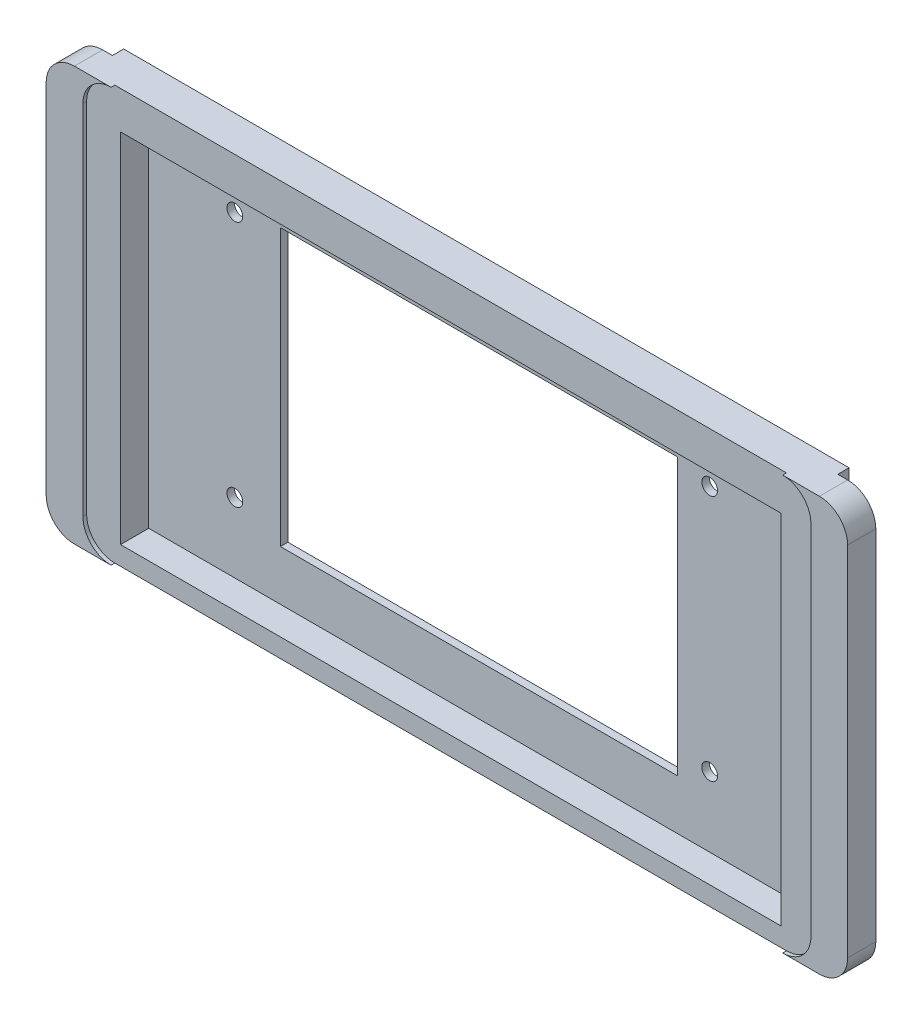
ISO-10303-21;
HEADER;
FILE_DESCRIPTION(('STEP AP214'),'2;1');
FILE_NAME('part.step','',(''),(''),'','','');
FILE_SCHEMA(('AUTOMOTIVE_DESIGN { 1 0 10303 214 1 1 1 1 }'));
ENDSEC;
DATA;
#1=APPLICATION_CONTEXT('core data for automotive mechanical design processes');
#2=APPLICATION_PROTOCOL_DEFINITION('international standard','automotive_design',2000,#1);
#3=PRODUCT_CONTEXT('',#1,'mechanical');
#4=PRODUCT('Part','Part','',(#3));
#5=PRODUCT_RELATED_PRODUCT_CATEGORY('part','',(#4));
#6=PRODUCT_DEFINITION_FORMATION('','',#4);
#7=PRODUCT_DEFINITION_CONTEXT('part definition',#1,'design');
#8=PRODUCT_DEFINITION('design','',#6,#7);
#9=PRODUCT_DEFINITION_SHAPE('','',#8);
#10=(LENGTH_UNIT() NAMED_UNIT(*) SI_UNIT(.MILLI.,.METRE.));
#11=(NAMED_UNIT(*) PLANE_ANGLE_UNIT() SI_UNIT($,.RADIAN.));
#12=(NAMED_UNIT(*) SI_UNIT($,.STERADIAN.) SOLID_ANGLE_UNIT());
#13=UNCERTAINTY_MEASURE_WITH_UNIT(LENGTH_MEASURE(1.E-05),#10,'distance_accuracy_value','');
#14=(GEOMETRIC_REPRESENTATION_CONTEXT(3) GLOBAL_UNCERTAINTY_ASSIGNED_CONTEXT((#13)) GLOBAL_UNIT_ASSIGNED_CONTEXT((#10,
#11,#12)) REPRESENTATION_CONTEXT('',''));
#15=CARTESIAN_POINT('',(0.,0.,0.));
#16=DIRECTION('',(0.,0.,1.));
#17=DIRECTION('',(1.,0.,0.));
#18=AXIS2_PLACEMENT_3D('',#15,#16,#17);
#19=CARTESIAN_POINT('',(99.,47.5,-10.5));
#20=DIRECTION('',(0.,0.,1.));
#21=DIRECTION('',(1.,0.,0.));
#22=AXIS2_PLACEMENT_3D('',#19,#20,#21);
#23=CYLINDRICAL_SURFACE('',#22,7.5);
#24=DIRECTION('',(0.,0.,1.));
#25=VECTOR('',#24,1.);
#26=CARTESIAN_POINT('',(106.5,47.4999999999999,-10.5));
#27=LINE('',#26,#25);
#28=CARTESIAN_POINT('',(106.5,47.4999999999999,-7.5));
#29=VERTEX_POINT('',#28);
#30=CARTESIAN_POINT('',(106.5,47.4999999999999,0.));
#31=VERTEX_POINT('',#30);
#32=EDGE_CURVE('E270',#29,#31,#27,.T.);
#33=ORIENTED_EDGE('',*,*,#32,.F.);
#34=CARTESIAN_POINT('',(99.,47.5,-7.5));
#35=DIRECTION('',(0.,0.,-1.));
#36=DIRECTION('',(1.,0.,0.));
#37=AXIS2_PLACEMENT_3D('',#34,#35,#36);
#38=CIRCLE('',#37,7.5);
#39=CARTESIAN_POINT('',(99.,55.,-7.5));
#40=VERTEX_POINT('',#39);
#41=EDGE_CURVE('E552',#40,#29,#38,.T.);
#42=ORIENTED_EDGE('',*,*,#41,.F.);
#43=DIRECTION('',(0.,0.,1.));
#44=VECTOR('',#43,1.);
#45=CARTESIAN_POINT('',(99.,55.,-10.5));
#46=LINE('',#45,#44);
#47=CARTESIAN_POINT('',(99.,55.,0.));
#48=VERTEX_POINT('',#47);
#49=EDGE_CURVE('E331',#40,#48,#46,.T.);
#50=ORIENTED_EDGE('',*,*,#49,.T.);
#51=CARTESIAN_POINT('',(99.,47.5,0.));
#52=DIRECTION('',(0.,0.,1.));
#53=DIRECTION('',(-1.,0.,0.));
#54=AXIS2_PLACEMENT_3D('',#51,#52,#53);
#55=CIRCLE('',#54,7.5);
#56=EDGE_CURVE('E321',#31,#48,#55,.T.);
#57=ORIENTED_EDGE('',*,*,#56,.F.);
#58=EDGE_LOOP('',(#33,#42,#50,#57));
#59=FACE_BOUND('',#58,.T.);
#60=ADVANCED_FACE('F53',(#59),#23,.T.);
#61=CARTESIAN_POINT('',(106.5,47.4999999999999,-10.5));
#62=DIRECTION('',(1.,0.,0.));
#63=DIRECTION('',(0.,0.,-1.));
#64=AXIS2_PLACEMENT_3D('',#61,#62,#63);
#65=PLANE('',#64);
#66=DIRECTION('',(0.,0.,1.));
#67=VECTOR('',#66,1.);
#68=CARTESIAN_POINT('',(106.5,-47.4999999999999,-10.5));
#69=LINE('',#68,#67);
#70=CARTESIAN_POINT('',(106.5,-47.4999999999999,-7.5));
#71=VERTEX_POINT('',#70);
#72=CARTESIAN_POINT('',(106.5,-47.4999999999999,0.));
#73=VERTEX_POINT('',#72);
#74=EDGE_CURVE('E265',#71,#73,#69,.T.);
#75=ORIENTED_EDGE('',*,*,#74,.F.);
#76=DIRECTION('',(0.,-1.,0.));
#77=VECTOR('',#76,1.);
#78=CARTESIAN_POINT('',(106.5,47.4999999999999,-7.5));
#79=LINE('',#78,#77);
#80=EDGE_CURVE('E244',#29,#71,#79,.T.);
#81=ORIENTED_EDGE('',*,*,#80,.F.);
#82=ORIENTED_EDGE('',*,*,#32,.T.);
#83=DIRECTION('',(0.,1.,0.));
#84=VECTOR('',#83,1.);
#85=CARTESIAN_POINT('',(106.5,47.4999999999999,0.));
#86=LINE('',#85,#84);
#87=EDGE_CURVE('E317',#73,#31,#86,.T.);
#88=ORIENTED_EDGE('',*,*,#87,.F.);
#89=EDGE_LOOP('',(#75,#81,#82,#88));
#90=FACE_BOUND('',#89,.T.);
#91=ADVANCED_FACE('F338',(#90),#65,.T.);
#92=CARTESIAN_POINT('',(99.,-47.5,-10.5));
#93=DIRECTION('',(0.,0.,1.));
#94=DIRECTION('',(1.,0.,0.));
#95=AXIS2_PLACEMENT_3D('',#92,#93,#94);
#96=CYLINDRICAL_SURFACE('',#95,7.5);
#97=DIRECTION('',(0.,0.,1.));
#98=VECTOR('',#97,1.);
#99=CARTESIAN_POINT('',(99.,-55.,-10.5));
#100=LINE('',#99,#98);
#101=CARTESIAN_POINT('',(98.9999999999999,-55.,-7.5));
#102=VERTEX_POINT('',#101);
#103=CARTESIAN_POINT('',(99.,-55.,0.));
#104=VERTEX_POINT('',#103);
#105=EDGE_CURVE('E254',#102,#104,#100,.T.);
#106=ORIENTED_EDGE('',*,*,#105,.F.);
#107=CARTESIAN_POINT('',(99.,-47.5,-7.5));
#108=DIRECTION('',(0.,0.,-1.));
#109=DIRECTION('',(-1.,0.,0.));
#110=AXIS2_PLACEMENT_3D('',#107,#108,#109);
#111=CIRCLE('',#110,7.5);
#112=EDGE_CURVE('E238',#71,#102,#111,.T.);
#113=ORIENTED_EDGE('',*,*,#112,.F.);
#114=ORIENTED_EDGE('',*,*,#74,.T.);
#115=CARTESIAN_POINT('',(99.,-47.5,0.));
#116=DIRECTION('',(0.,0.,1.));
#117=DIRECTION('',(1.,0.,0.));
#118=AXIS2_PLACEMENT_3D('',#115,#116,#117);
#119=CIRCLE('',#118,7.5);
#120=EDGE_CURVE('E263',#104,#73,#119,.T.);
#121=ORIENTED_EDGE('',*,*,#120,.F.);
#122=EDGE_LOOP('',(#106,#113,#114,#121));
#123=FACE_BOUND('',#122,.T.);
#124=ADVANCED_FACE('F261',(#123),#96,.T.);
#125=CARTESIAN_POINT('',(-64.86,-31.45,-1.));
#126=DIRECTION('',(0.,0.,1.));
#127=DIRECTION('',(1.,0.,0.));
#128=AXIS2_PLACEMENT_3D('',#125,#126,#127);
#129=CYLINDRICAL_SURFACE('',#128,2.1);
#130=CARTESIAN_POINT('',(-64.86,-31.45,-10.5));
#131=DIRECTION('',(0.,0.,1.));
#132=DIRECTION('',(1.,0.,0.));
#133=AXIS2_PLACEMENT_3D('',#130,#131,#132);
#134=CIRCLE('',#133,2.1);
#135=CARTESIAN_POINT('',(-62.76,-31.45,-10.5));
#136=VERTEX_POINT('',#135);
#137=EDGE_CURVE('E428',#136,#136,#134,.T.);
#138=ORIENTED_EDGE('',*,*,#137,.F.);
#139=EDGE_LOOP('',(#138));
#140=FACE_BOUND('',#139,.T.);
#141=CARTESIAN_POINT('',(-64.86,-31.45,-8.5));
#142=DIRECTION('',(0.,0.,1.));
#143=DIRECTION('',(1.,0.,0.));
#144=AXIS2_PLACEMENT_3D('',#141,#142,#143);
#145=CIRCLE('',#144,2.1);
#146=CARTESIAN_POINT('',(-62.76,-31.45,-8.5));
#147=VERTEX_POINT('',#146);
#148=EDGE_CURVE('E476',#147,#147,#145,.F.);
#149=ORIENTED_EDGE('',*,*,#148,.F.);
#150=EDGE_LOOP('',(#149));
#151=FACE_BOUND('',#150,.T.);
#152=ADVANCED_FACE('F661',(#140,#151),#129,.F.);
#153=CARTESIAN_POINT('',(61.34,-31.45,-1.));
#154=DIRECTION('',(0.,0.,1.));
#155=DIRECTION('',(1.,0.,0.));
#156=AXIS2_PLACEMENT_3D('',#153,#154,#155);
#157=CYLINDRICAL_SURFACE('',#156,2.1);
#158=CARTESIAN_POINT('',(61.34,-31.45,-10.5));
#159=DIRECTION('',(0.,0.,1.));
#160=DIRECTION('',(1.,0.,0.));
#161=AXIS2_PLACEMENT_3D('',#158,#159,#160);
#162=CIRCLE('',#161,2.1);
#163=CARTESIAN_POINT('',(63.44,-31.45,-10.5));
#164=VERTEX_POINT('',#163);
#165=EDGE_CURVE('E432',#164,#164,#162,.T.);
#166=ORIENTED_EDGE('',*,*,#165,.F.);
#167=EDGE_LOOP('',(#166));
#168=FACE_BOUND('',#167,.T.);
#169=CARTESIAN_POINT('',(61.34,-31.45,-8.5));
#170=DIRECTION('',(0.,0.,1.));
#171=DIRECTION('',(1.,0.,0.));
#172=AXIS2_PLACEMENT_3D('',#169,#170,#171);
#173=CIRCLE('',#172,2.1);
#174=CARTESIAN_POINT('',(63.44,-31.45,-8.5));
#175=VERTEX_POINT('',#174);
#176=EDGE_CURVE('E480',#175,#175,#173,.F.);
#177=ORIENTED_EDGE('',*,*,#176,.F.);
#178=EDGE_LOOP('',(#177));
#179=FACE_BOUND('',#178,.T.);
#180=ADVANCED_FACE('F698',(#168,#179),#157,.F.);
#181=CARTESIAN_POINT('',(61.34,34.2,-1.));
#182=DIRECTION('',(0.,0.,1.));
#183=DIRECTION('',(1.,0.,0.));
#184=AXIS2_PLACEMENT_3D('',#181,#182,#183);
#185=CYLINDRICAL_SURFACE('',#184,2.1);
#186=CARTESIAN_POINT('',(61.34,34.2,-10.5));
#187=DIRECTION('',(0.,0.,1.));
#188=DIRECTION('',(1.,0.,0.));
#189=AXIS2_PLACEMENT_3D('',#186,#187,#188);
#190=CIRCLE('',#189,2.1);
#191=CARTESIAN_POINT('',(63.44,34.2,-10.5));
#192=VERTEX_POINT('',#191);
#193=EDGE_CURVE('E436',#192,#192,#190,.T.);
#194=ORIENTED_EDGE('',*,*,#193,.F.);
#195=EDGE_LOOP('',(#194));
#196=FACE_BOUND('',#195,.T.);
#197=CARTESIAN_POINT('',(61.34,34.2,-8.5));
#198=DIRECTION('',(0.,0.,1.));
#199=DIRECTION('',(1.,0.,0.));
#200=AXIS2_PLACEMENT_3D('',#197,#198,#199);
#201=CIRCLE('',#200,2.1);
#202=CARTESIAN_POINT('',(63.44,34.2,-8.5));
#203=VERTEX_POINT('',#202);
#204=EDGE_CURVE('E484',#203,#203,#201,.F.);
#205=ORIENTED_EDGE('',*,*,#204,.F.);
#206=EDGE_LOOP('',(#205));
#207=FACE_BOUND('',#206,.T.);
#208=ADVANCED_FACE('F702',(#196,#207),#185,.F.);
#209=CARTESIAN_POINT('',(-64.86,34.2,-1.));
#210=DIRECTION('',(0.,0.,1.));
#211=DIRECTION('',(1.,0.,0.));
#212=AXIS2_PLACEMENT_3D('',#209,#210,#211);
#213=CYLINDRICAL_SURFACE('',#212,2.1);
#214=CARTESIAN_POINT('',(-64.86,34.2,-10.5));
#215=DIRECTION('',(0.,0.,1.));
#216=DIRECTION('',(1.,0.,0.));
#217=AXIS2_PLACEMENT_3D('',#214,#215,#216);
#218=CIRCLE('',#217,2.1);
#219=CARTESIAN_POINT('',(-62.76,34.2,-10.5));
#220=VERTEX_POINT('',#219);
#221=EDGE_CURVE('E440',#220,#220,#218,.T.);
#222=ORIENTED_EDGE('',*,*,#221,.F.);
#223=EDGE_LOOP('',(#222));
#224=FACE_BOUND('',#223,.T.);
#225=CARTESIAN_POINT('',(-64.86,34.2,-8.5));
#226=DIRECTION('',(0.,0.,1.));
#227=DIRECTION('',(1.,0.,0.));
#228=AXIS2_PLACEMENT_3D('',#225,#226,#227);
#229=CIRCLE('',#228,2.1);
#230=CARTESIAN_POINT('',(-62.76,34.2,-8.5));
#231=VERTEX_POINT('',#230);
#232=EDGE_CURVE('E488',#231,#231,#229,.F.);
#233=ORIENTED_EDGE('',*,*,#232,.F.);
#234=EDGE_LOOP('',(#233));
#235=FACE_BOUND('',#234,.T.);
#236=ADVANCED_FACE('F706',(#224,#235),#213,.F.);
#237=CARTESIAN_POINT('',(52.76,-36.6995399693422,-10.5));
#238=DIRECTION('',(1.,0.,0.));
#239=DIRECTION('',(0.,0.,-1.));
#240=AXIS2_PLACEMENT_3D('',#237,#238,#239);
#241=PLANE('',#240);
#242=DIRECTION('',(0.,-1.,0.));
#243=VECTOR('',#242,1.);
#244=CARTESIAN_POINT('',(52.76,-36.6995399693422,-8.5));
#245=LINE('',#244,#243);
#246=CARTESIAN_POINT('',(52.76,36.6995399693422,-8.5));
#247=VERTEX_POINT('',#246);
#248=CARTESIAN_POINT('',(52.76,-36.6995399693422,-8.5));
#249=VERTEX_POINT('',#248);
#250=EDGE_CURVE('E492',#247,#249,#245,.T.);
#251=ORIENTED_EDGE('',*,*,#250,.F.);
#252=DIRECTION('',(0.,0.,1.));
#253=VECTOR('',#252,1.);
#254=CARTESIAN_POINT('',(52.76,36.6995399693422,-10.5));
#255=LINE('',#254,#253);
#256=CARTESIAN_POINT('',(52.76,36.6995399693422,-10.5));
#257=VERTEX_POINT('',#256);
#258=EDGE_CURVE('E456',#257,#247,#255,.T.);
#259=ORIENTED_EDGE('',*,*,#258,.F.);
#260=DIRECTION('',(0.,1.,0.));
#261=VECTOR('',#260,1.);
#262=CARTESIAN_POINT('',(52.76,-36.6995399693422,-10.5));
#263=LINE('',#262,#261);
#264=CARTESIAN_POINT('',(52.76,-36.6995399693422,-10.5));
#265=VERTEX_POINT('',#264);
#266=EDGE_CURVE('E472',#265,#257,#263,.T.);
#267=ORIENTED_EDGE('',*,*,#266,.F.);
#268=DIRECTION('',(0.,0.,1.));
#269=VECTOR('',#268,1.);
#270=CARTESIAN_POINT('',(52.76,-36.6995399693422,-10.5));
#271=LINE('',#270,#269);
#272=EDGE_CURVE('E444',#265,#249,#271,.T.);
#273=ORIENTED_EDGE('',*,*,#272,.T.);
#274=EDGE_LOOP('',(#251,#259,#267,#273));
#275=FACE_BOUND('',#274,.T.);
#276=ADVANCED_FACE('F710',(#275),#241,.F.);
#277=CARTESIAN_POINT('',(-52.76,-36.6995399693422,-10.5));
#278=DIRECTION('',(0.,-1.,0.));
#279=DIRECTION('',(0.,0.,-1.));
#280=AXIS2_PLACEMENT_3D('',#277,#278,#279);
#281=PLANE('',#280);
#282=DIRECTION('',(-1.,0.,0.));
#283=VECTOR('',#282,1.);
#284=CARTESIAN_POINT('',(-52.76,-36.6995399693422,-8.5));
#285=LINE('',#284,#283);
#286=CARTESIAN_POINT('',(-52.76,-36.6995399693422,-8.5));
#287=VERTEX_POINT('',#286);
#288=EDGE_CURVE('E495',#249,#287,#285,.T.);
#289=ORIENTED_EDGE('',*,*,#288,.F.);
#290=ORIENTED_EDGE('',*,*,#272,.F.);
#291=DIRECTION('',(1.,0.,0.));
#292=VECTOR('',#291,1.);
#293=CARTESIAN_POINT('',(-52.76,-36.6995399693422,-10.5));
#294=LINE('',#293,#292);
#295=CARTESIAN_POINT('',(-52.76,-36.6995399693422,-10.5));
#296=VERTEX_POINT('',#295);
#297=EDGE_CURVE('E460',#296,#265,#294,.T.);
#298=ORIENTED_EDGE('',*,*,#297,.F.);
#299=DIRECTION('',(0.,0.,1.));
#300=VECTOR('',#299,1.);
#301=CARTESIAN_POINT('',(-52.76,-36.6995399693422,-10.5));
#302=LINE('',#301,#300);
#303=EDGE_CURVE('E448',#296,#287,#302,.T.);
#304=ORIENTED_EDGE('',*,*,#303,.T.);
#305=EDGE_LOOP('',(#289,#290,#298,#304));
#306=FACE_BOUND('',#305,.T.);
#307=ADVANCED_FACE('F714',(#306),#281,.F.);
#308=CARTESIAN_POINT('',(-52.76,-36.6995399693422,-10.5));
#309=DIRECTION('',(-1.,0.,0.));
#310=DIRECTION('',(0.,0.,1.));
#311=AXIS2_PLACEMENT_3D('',#308,#309,#310);
#312=PLANE('',#311);
#313=DIRECTION('',(0.,1.,0.));
#314=VECTOR('',#313,1.);
#315=CARTESIAN_POINT('',(-52.76,-36.6995399693422,-8.5));
#316=LINE('',#315,#314);
#317=CARTESIAN_POINT('',(-52.76,36.6995399693422,-8.5));
#318=VERTEX_POINT('',#317);
#319=EDGE_CURVE('E498',#287,#318,#316,.T.);
#320=ORIENTED_EDGE('',*,*,#319,.F.);
#321=ORIENTED_EDGE('',*,*,#303,.F.);
#322=DIRECTION('',(0.,-1.,0.));
#323=VECTOR('',#322,1.);
#324=CARTESIAN_POINT('',(-52.76,-36.6995399693422,-10.5));
#325=LINE('',#324,#323);
#326=CARTESIAN_POINT('',(-52.76,36.6995399693422,-10.5));
#327=VERTEX_POINT('',#326);
#328=EDGE_CURVE('E464',#327,#296,#325,.T.);
#329=ORIENTED_EDGE('',*,*,#328,.F.);
#330=DIRECTION('',(0.,0.,1.));
#331=VECTOR('',#330,1.);
#332=CARTESIAN_POINT('',(-52.76,36.6995399693422,-10.5));
#333=LINE('',#332,#331);
#334=EDGE_CURVE('E452',#327,#318,#333,.T.);
#335=ORIENTED_EDGE('',*,*,#334,.T.);
#336=EDGE_LOOP('',(#320,#321,#329,#335));
#337=FACE_BOUND('',#336,.T.);
#338=ADVANCED_FACE('F718',(#337),#312,.F.);
#339=CARTESIAN_POINT('',(-52.76,36.6995399693422,-10.5));
#340=DIRECTION('',(0.,1.,0.));
#341=DIRECTION('',(0.,0.,1.));
#342=AXIS2_PLACEMENT_3D('',#339,#340,#341);
#343=PLANE('',#342);
#344=DIRECTION('',(1.,0.,0.));
#345=VECTOR('',#344,1.);
#346=CARTESIAN_POINT('',(-52.76,36.6995399693422,-8.5));
#347=LINE('',#346,#345);
#348=EDGE_CURVE('E12',#318,#247,#347,.T.);
#349=ORIENTED_EDGE('',*,*,#348,.F.);
#350=ORIENTED_EDGE('',*,*,#334,.F.);
#351=DIRECTION('',(-1.,0.,0.));
#352=VECTOR('',#351,1.);
#353=CARTESIAN_POINT('',(-52.76,36.6995399693422,-10.5));
#354=LINE('',#353,#352);
#355=EDGE_CURVE('E468',#257,#327,#354,.T.);
#356=ORIENTED_EDGE('',*,*,#355,.F.);
#357=ORIENTED_EDGE('',*,*,#258,.T.);
#358=EDGE_LOOP('',(#349,#350,#356,#357));
#359=FACE_BOUND('',#358,.T.);
#360=ADVANCED_FACE('F664',(#359),#343,.F.);
#361=CARTESIAN_POINT('',(-98.9999999999999,-55.,-10.5));
#362=DIRECTION('',(0.,-1.,0.));
#363=DIRECTION('',(0.,0.,-1.));
#364=AXIS2_PLACEMENT_3D('',#361,#362,#363);
#365=PLANE('',#364);
#366=DIRECTION('',(0.,0.,-1.));
#367=VECTOR('',#366,1.);
#368=CARTESIAN_POINT('',(96.4,-55.,-7.5));
#369=LINE('',#368,#367);
#370=CARTESIAN_POINT('',(96.4,-55.,-7.5));
#371=VERTEX_POINT('',#370);
#372=CARTESIAN_POINT('',(96.4,-55.,-10.5));
#373=VERTEX_POINT('',#372);
#374=EDGE_CURVE('E69',#371,#373,#369,.T.);
#375=ORIENTED_EDGE('',*,*,#374,.F.);
#376=DIRECTION('',(-1.,0.,0.));
#377=VECTOR('',#376,1.);
#378=CARTESIAN_POINT('',(96.4,-55.,-7.5));
#379=LINE('',#378,#377);
#380=EDGE_CURVE('E242',#102,#371,#379,.T.);
#381=ORIENTED_EDGE('',*,*,#380,.F.);
#382=ORIENTED_EDGE('',*,*,#105,.T.);
#383=DIRECTION('',(1.,0.,0.));
#384=VECTOR('',#383,1.);
#385=CARTESIAN_POINT('',(-98.9999999999999,-55.,0.));
#386=LINE('',#385,#384);
#387=CARTESIAN_POINT('',(89.25,-55.,0.));
#388=VERTEX_POINT('',#387);
#389=EDGE_CURVE('E310',#388,#104,#386,.T.);
#390=ORIENTED_EDGE('',*,*,#389,.F.);
#391=DIRECTION('',(0.,0.,1.));
#392=VECTOR('',#391,1.);
#393=CARTESIAN_POINT('',(89.25,-55.,-1.));
#394=LINE('',#393,#392);
#395=CARTESIAN_POINT('',(89.25,-55.,-1.));
#396=VERTEX_POINT('',#395);
#397=EDGE_CURVE('E370',#396,#388,#394,.T.);
#398=ORIENTED_EDGE('',*,*,#397,.F.);
#399=DIRECTION('',(1.,0.,0.));
#400=VECTOR('',#399,1.);
#401=CARTESIAN_POINT('',(-89.25,-55.,-1.));
#402=LINE('',#401,#400);
#403=CARTESIAN_POINT('',(-89.25,-55.,-1.));
#404=VERTEX_POINT('',#403);
#405=EDGE_CURVE('E400',#404,#396,#402,.T.);
#406=ORIENTED_EDGE('',*,*,#405,.F.);
#407=DIRECTION('',(0.,0.,1.));
#408=VECTOR('',#407,1.);
#409=CARTESIAN_POINT('',(-89.25,-55.,-1.));
#410=LINE('',#409,#408);
#411=CARTESIAN_POINT('',(-89.25,-55.,0.));
#412=VERTEX_POINT('',#411);
#413=EDGE_CURVE('E373',#404,#412,#410,.T.);
#414=ORIENTED_EDGE('',*,*,#413,.T.);
#415=CARTESIAN_POINT('',(-98.9999999999999,-55.,0.));
#416=VERTEX_POINT('',#415);
#417=EDGE_CURVE('E311',#416,#412,#386,.T.);
#418=ORIENTED_EDGE('',*,*,#417,.F.);
#419=DIRECTION('',(0.,0.,1.));
#420=VECTOR('',#419,1.);
#421=CARTESIAN_POINT('',(-98.9999999999999,-55.,-10.5));
#422=LINE('',#421,#420);
#423=CARTESIAN_POINT('',(-98.9999999999999,-55.,-7.5));
#424=VERTEX_POINT('',#423);
#425=EDGE_CURVE('E266',#424,#416,#422,.T.);
#426=ORIENTED_EDGE('',*,*,#425,.F.);
#427=DIRECTION('',(-1.,0.,0.));
#428=VECTOR('',#427,1.);
#429=CARTESIAN_POINT('',(-96.4,-55.,-7.5));
#430=LINE('',#429,#428);
#431=CARTESIAN_POINT('',(-96.4,-55.,-7.5));
#432=VERTEX_POINT('',#431);
#433=EDGE_CURVE('E569',#432,#424,#430,.T.);
#434=ORIENTED_EDGE('',*,*,#433,.F.);
#435=DIRECTION('',(0.,0.,-1.));
#436=VECTOR('',#435,1.);
#437=CARTESIAN_POINT('',(-96.4,-55.,-7.5));
#438=LINE('',#437,#436);
#439=CARTESIAN_POINT('',(-96.4,-55.,-10.5));
#440=VERTEX_POINT('',#439);
#441=EDGE_CURVE('E585',#432,#440,#438,.T.);
#442=ORIENTED_EDGE('',*,*,#441,.T.);
#443=DIRECTION('',(1.,0.,0.));
#444=VECTOR('',#443,1.);
#445=CARTESIAN_POINT('',(-98.9999999999999,-55.,-10.5));
#446=LINE('',#445,#444);
#447=EDGE_CURVE('E287',#440,#373,#446,.T.);
#448=ORIENTED_EDGE('',*,*,#447,.T.);
#449=EDGE_LOOP('',(#375,#381,#382,#390,#398,#406,#414,#418,#426,#434,#442,#448));
#450=FACE_BOUND('',#449,.T.);
#451=ADVANCED_FACE('F252',(#450),#365,.T.);
#452=CARTESIAN_POINT('',(-99.,47.5,0.));
#453=DIRECTION('',(0.,0.,1.));
#454=DIRECTION('',(1.,0.,0.));
#455=AXIS2_PLACEMENT_3D('',#452,#453,#454);
#456=PLANE('',#455);
#457=CARTESIAN_POINT('',(-89.25,-47.5,0.));
#458=DIRECTION('',(0.,0.,1.));
#459=DIRECTION('',(1.,0.,0.));
#460=AXIS2_PLACEMENT_3D('',#457,#458,#459);
#461=CIRCLE('',#460,7.5);
#462=CARTESIAN_POINT('',(-96.75,-47.4999999999999,0.));
#463=VERTEX_POINT('',#462);
#464=EDGE_CURVE('E425',#463,#412,#461,.T.);
#465=ORIENTED_EDGE('',*,*,#464,.F.);
#466=DIRECTION('',(0.,-1.,0.));
#467=VECTOR('',#466,1.);
#468=CARTESIAN_POINT('',(-96.75,47.4999999999999,0.));
#469=LINE('',#468,#467);
#470=CARTESIAN_POINT('',(-96.75,47.4999999999999,0.));
#471=VERTEX_POINT('',#470);
#472=EDGE_CURVE('E408',#471,#463,#469,.T.);
#473=ORIENTED_EDGE('',*,*,#472,.F.);
#474=CARTESIAN_POINT('',(-89.25,47.5,0.));
#475=DIRECTION('',(0.,0.,1.));
#476=DIRECTION('',(1.,0.,0.));
#477=AXIS2_PLACEMENT_3D('',#474,#475,#476);
#478=CIRCLE('',#477,7.5);
#479=CARTESIAN_POINT('',(-89.25,55.,0.));
#480=VERTEX_POINT('',#479);
#481=EDGE_CURVE('E412',#480,#471,#478,.T.);
#482=ORIENTED_EDGE('',*,*,#481,.F.);
#483=DIRECTION('',(-1.,0.,0.));
#484=VECTOR('',#483,1.);
#485=CARTESIAN_POINT('',(-98.9999999999999,55.,0.));
#486=LINE('',#485,#484);
#487=CARTESIAN_POINT('',(-98.9999999999999,55.,0.));
#488=VERTEX_POINT('',#487);
#489=EDGE_CURVE('E325',#480,#488,#486,.T.);
#490=ORIENTED_EDGE('',*,*,#489,.T.);
#491=CARTESIAN_POINT('',(-99.,47.5,0.));
#492=DIRECTION('',(0.,0.,1.));
#493=DIRECTION('',(1.,0.,0.));
#494=AXIS2_PLACEMENT_3D('',#491,#492,#493);
#495=CIRCLE('',#494,7.5);
#496=CARTESIAN_POINT('',(-106.5,47.4999999999999,0.));
#497=VERTEX_POINT('',#496);
#498=EDGE_CURVE('E297',#488,#497,#495,.T.);
#499=ORIENTED_EDGE('',*,*,#498,.T.);
#500=DIRECTION('',(0.,-1.,0.));
#501=VECTOR('',#500,1.);
#502=CARTESIAN_POINT('',(-106.5,47.4999999999999,0.));
#503=LINE('',#502,#501);
#504=CARTESIAN_POINT('',(-106.5,-47.4999999999999,0.));
#505=VERTEX_POINT('',#504);
#506=EDGE_CURVE('E301',#497,#505,#503,.T.);
#507=ORIENTED_EDGE('',*,*,#506,.T.);
#508=CARTESIAN_POINT('',(-99.,-47.5,0.));
#509=DIRECTION('',(0.,0.,1.));
#510=DIRECTION('',(1.,0.,0.));
#511=AXIS2_PLACEMENT_3D('',#508,#509,#510);
#512=CIRCLE('',#511,7.5);
#513=EDGE_CURVE('E306',#505,#416,#512,.T.);
#514=ORIENTED_EDGE('',*,*,#513,.T.);
#515=ORIENTED_EDGE('',*,*,#417,.T.);
#516=EDGE_LOOP('',(#465,#473,#482,#490,#499,#507,#514,#515));
#517=FACE_BOUND('',#516,.T.);
#518=ADVANCED_FACE('F619',(#517),#456,.T.);
#519=CARTESIAN_POINT('',(-99.,47.5,-10.5));
#520=DIRECTION('',(0.,0.,1.));
#521=DIRECTION('',(1.,0.,0.));
#522=AXIS2_PLACEMENT_3D('',#519,#520,#521);
#523=CYLINDRICAL_SURFACE('',#522,7.5);
#524=CARTESIAN_POINT('',(-99.,47.5,-7.5));
#525=DIRECTION('',(0.,0.,-1.));
#526=DIRECTION('',(-1.,0.,0.));
#527=AXIS2_PLACEMENT_3D('',#524,#525,#526);
#528=CIRCLE('',#527,7.5);
#529=CARTESIAN_POINT('',(-106.5,47.4999999999999,-7.5));
#530=VERTEX_POINT('',#529);
#531=CARTESIAN_POINT('',(-99.,55.,-7.5));
#532=VERTEX_POINT('',#531);
#533=EDGE_CURVE('E578',#530,#532,#528,.T.);
#534=ORIENTED_EDGE('',*,*,#533,.F.);
#535=DIRECTION('',(0.,0.,1.));
#536=VECTOR('',#535,1.);
#537=CARTESIAN_POINT('',(-106.5,47.4999999999999,-10.5));
#538=LINE('',#537,#536);
#539=EDGE_CURVE('E277',#530,#497,#538,.T.);
#540=ORIENTED_EDGE('',*,*,#539,.T.);
#541=ORIENTED_EDGE('',*,*,#498,.F.);
#542=DIRECTION('',(0.,0.,1.));
#543=VECTOR('',#542,1.);
#544=CARTESIAN_POINT('',(-98.9999999999999,55.,-10.5));
#545=LINE('',#544,#543);
#546=EDGE_CURVE('E62',#532,#488,#545,.T.);
#547=ORIENTED_EDGE('',*,*,#546,.F.);
#548=EDGE_LOOP('',(#534,#540,#541,#547));
#549=FACE_BOUND('',#548,.T.);
#550=ADVANCED_FACE('F55',(#549),#523,.T.);
#551=CARTESIAN_POINT('',(-98.9999999999999,55.,-10.5));
#552=DIRECTION('',(0.,1.,0.));
#553=DIRECTION('',(0.,0.,1.));
#554=AXIS2_PLACEMENT_3D('',#551,#552,#553);
#555=PLANE('',#554);
#556=DIRECTION('',(0.,0.,-1.));
#557=VECTOR('',#556,1.);
#558=CARTESIAN_POINT('',(96.4,55.,-7.5));
#559=LINE('',#558,#557);
#560=CARTESIAN_POINT('',(96.4,55.,-7.5));
#561=VERTEX_POINT('',#560);
#562=CARTESIAN_POINT('',(96.4,55.,-10.5));
#563=VERTEX_POINT('',#562);
#564=EDGE_CURVE('E545',#561,#563,#559,.T.);
#565=ORIENTED_EDGE('',*,*,#564,.T.);
#566=DIRECTION('',(-1.,0.,0.));
#567=VECTOR('',#566,1.);
#568=CARTESIAN_POINT('',(-98.9999999999999,55.,-10.5));
#569=LINE('',#568,#567);
#570=CARTESIAN_POINT('',(-96.4,55.,-10.5));
#571=VERTEX_POINT('',#570);
#572=EDGE_CURVE('E279',#563,#571,#569,.T.);
#573=ORIENTED_EDGE('',*,*,#572,.T.);
#574=DIRECTION('',(0.,0.,-1.));
#575=VECTOR('',#574,1.);
#576=CARTESIAN_POINT('',(-96.4,55.,-7.5));
#577=LINE('',#576,#575);
#578=CARTESIAN_POINT('',(-96.4,55.,-7.5));
#579=VERTEX_POINT('',#578);
#580=EDGE_CURVE('E77',#579,#571,#577,.T.);
#581=ORIENTED_EDGE('',*,*,#580,.F.);
#582=DIRECTION('',(1.,0.,0.));
#583=VECTOR('',#582,1.);
#584=CARTESIAN_POINT('',(-96.4,55.,-7.5));
#585=LINE('',#584,#583);
#586=EDGE_CURVE('E581',#532,#579,#585,.T.);
#587=ORIENTED_EDGE('',*,*,#586,.F.);
#588=ORIENTED_EDGE('',*,*,#546,.T.);
#589=ORIENTED_EDGE('',*,*,#489,.F.);
#590=DIRECTION('',(0.,0.,1.));
#591=VECTOR('',#590,1.);
#592=CARTESIAN_POINT('',(-89.25,55.,-1.));
#593=LINE('',#592,#591);
#594=CARTESIAN_POINT('',(-89.25,55.,-1.));
#595=VERTEX_POINT('',#594);
#596=EDGE_CURVE('E357',#595,#480,#593,.T.);
#597=ORIENTED_EDGE('',*,*,#596,.F.);
#598=DIRECTION('',(-1.,0.,0.));
#599=VECTOR('',#598,1.);
#600=CARTESIAN_POINT('',(-89.25,55.,-1.));
#601=LINE('',#600,#599);
#602=CARTESIAN_POINT('',(89.25,55.,-1.));
#603=VERTEX_POINT('',#602);
#604=EDGE_CURVE('E384',#603,#595,#601,.T.);
#605=ORIENTED_EDGE('',*,*,#604,.F.);
#606=DIRECTION('',(0.,0.,1.));
#607=VECTOR('',#606,1.);
#608=CARTESIAN_POINT('',(89.25,55.,-1.));
#609=LINE('',#608,#607);
#610=CARTESIAN_POINT('',(89.25,55.,0.));
#611=VERTEX_POINT('',#610);
#612=EDGE_CURVE('E360',#603,#611,#609,.T.);
#613=ORIENTED_EDGE('',*,*,#612,.T.);
#614=EDGE_CURVE('E293',#48,#611,#486,.T.);
#615=ORIENTED_EDGE('',*,*,#614,.F.);
#616=ORIENTED_EDGE('',*,*,#49,.F.);
#617=DIRECTION('',(1.,0.,0.));
#618=VECTOR('',#617,1.);
#619=CARTESIAN_POINT('',(96.4,55.,-7.5));
#620=LINE('',#619,#618);
#621=EDGE_CURVE('E555',#561,#40,#620,.T.);
#622=ORIENTED_EDGE('',*,*,#621,.F.);
#623=EDGE_LOOP('',(#565,#573,#581,#587,#588,#589,#597,#605,#613,#615,#616,#622));
#624=FACE_BOUND('',#623,.T.);
#625=ADVANCED_FACE('F598',(#624),#555,.T.);
#626=CARTESIAN_POINT('',(-99.,-47.5,-10.5));
#627=DIRECTION('',(0.,0.,1.));
#628=DIRECTION('',(1.,0.,0.));
#629=AXIS2_PLACEMENT_3D('',#626,#627,#628);
#630=CYLINDRICAL_SURFACE('',#629,7.5);
#631=CARTESIAN_POINT('',(-99.,-47.5,-7.5));
#632=DIRECTION('',(0.,0.,-1.));
#633=DIRECTION('',(1.,0.,0.));
#634=AXIS2_PLACEMENT_3D('',#631,#632,#633);
#635=CIRCLE('',#634,7.5);
#636=CARTESIAN_POINT('',(-106.5,-47.4999999999999,-7.5));
#637=VERTEX_POINT('',#636);
#638=EDGE_CURVE('E572',#424,#637,#635,.T.);
#639=ORIENTED_EDGE('',*,*,#638,.F.);
#640=ORIENTED_EDGE('',*,*,#425,.T.);
#641=ORIENTED_EDGE('',*,*,#513,.F.);
#642=DIRECTION('',(0.,0.,1.));
#643=VECTOR('',#642,1.);
#644=CARTESIAN_POINT('',(-106.5,-47.4999999999999,-10.5));
#645=LINE('',#644,#643);
#646=EDGE_CURVE('E272',#637,#505,#645,.T.);
#647=ORIENTED_EDGE('',*,*,#646,.F.);
#648=EDGE_LOOP('',(#639,#640,#641,#647));
#649=FACE_BOUND('',#648,.T.);
#650=ADVANCED_FACE('F624',(#649),#630,.T.);
#651=CARTESIAN_POINT('',(-106.5,47.4999999999999,-10.5));
#652=DIRECTION('',(-1.,0.,0.));
#653=DIRECTION('',(0.,-1.,0.));
#654=AXIS2_PLACEMENT_3D('',#651,#652,#653);
#655=PLANE('',#654);
#656=DIRECTION('',(0.,1.,0.));
#657=VECTOR('',#656,1.);
#658=CARTESIAN_POINT('',(-106.5,47.4999999999999,-7.5));
#659=LINE('',#658,#657);
#660=EDGE_CURVE('E575',#637,#530,#659,.T.);
#661=ORIENTED_EDGE('',*,*,#660,.F.);
#662=ORIENTED_EDGE('',*,*,#646,.T.);
#663=ORIENTED_EDGE('',*,*,#506,.F.);
#664=ORIENTED_EDGE('',*,*,#539,.F.);
#665=EDGE_LOOP('',(#661,#662,#663,#664));
#666=FACE_BOUND('',#665,.T.);
#667=ADVANCED_FACE('F630',(#666),#655,.T.);
#668=CARTESIAN_POINT('',(-99.,47.5,-10.5));
#669=DIRECTION('',(0.,0.,1.));
#670=DIRECTION('',(1.,0.,0.));
#671=AXIS2_PLACEMENT_3D('',#668,#669,#670);
#672=PLANE('',#671);
#673=ORIENTED_EDGE('',*,*,#297,.T.);
#674=ORIENTED_EDGE('',*,*,#266,.T.);
#675=ORIENTED_EDGE('',*,*,#355,.T.);
#676=ORIENTED_EDGE('',*,*,#328,.T.);
#677=EDGE_LOOP('',(#673,#674,#675,#676));
#678=FACE_BOUND('',#677,.T.);
#679=ORIENTED_EDGE('',*,*,#221,.T.);
#680=EDGE_LOOP('',(#679));
#681=FACE_BOUND('',#680,.T.);
#682=ORIENTED_EDGE('',*,*,#193,.T.);
#683=EDGE_LOOP('',(#682));
#684=FACE_BOUND('',#683,.T.);
#685=ORIENTED_EDGE('',*,*,#165,.T.);
#686=EDGE_LOOP('',(#685));
#687=FACE_BOUND('',#686,.T.);
#688=ORIENTED_EDGE('',*,*,#137,.T.);
#689=EDGE_LOOP('',(#688));
#690=FACE_BOUND('',#689,.T.);
#691=ORIENTED_EDGE('',*,*,#572,.F.);
#692=DIRECTION('',(0.,1.,0.));
#693=VECTOR('',#692,1.);
#694=CARTESIAN_POINT('',(96.4,55.,-10.5));
#695=LINE('',#694,#693);
#696=EDGE_CURVE('E249',#373,#563,#695,.T.);
#697=ORIENTED_EDGE('',*,*,#696,.F.);
#698=ORIENTED_EDGE('',*,*,#447,.F.);
#699=DIRECTION('',(0.,-1.,0.));
#700=VECTOR('',#699,1.);
#701=CARTESIAN_POINT('',(-96.4,55.,-10.5));
#702=LINE('',#701,#700);
#703=EDGE_CURVE('E562',#571,#440,#702,.T.);
#704=ORIENTED_EDGE('',*,*,#703,.F.);
#705=EDGE_LOOP('',(#691,#697,#698,#704));
#706=FACE_BOUND('',#705,.T.);
#707=ADVANCED_FACE('F595',(#678,#681,#684,#687,#690,#706),#672,.F.);
#708=CARTESIAN_POINT('',(89.25,47.5,0.));
#709=DIRECTION('',(0.,0.,1.));
#710=DIRECTION('',(-1.,0.,0.));
#711=AXIS2_PLACEMENT_3D('',#708,#709,#710);
#712=CIRCLE('',#711,7.5);
#713=CARTESIAN_POINT('',(96.75,47.4999999999999,0.));
#714=VERTEX_POINT('',#713);
#715=EDGE_CURVE('E416',#714,#611,#712,.T.);
#716=ORIENTED_EDGE('',*,*,#715,.F.);
#717=DIRECTION('',(0.,1.,0.));
#718=VECTOR('',#717,1.);
#719=CARTESIAN_POINT('',(96.75,47.4999999999999,0.));
#720=LINE('',#719,#718);
#721=CARTESIAN_POINT('',(96.75,-47.4999999999999,0.));
#722=VERTEX_POINT('',#721);
#723=EDGE_CURVE('E419',#722,#714,#720,.T.);
#724=ORIENTED_EDGE('',*,*,#723,.F.);
#725=CARTESIAN_POINT('',(89.25,-47.5,0.));
#726=DIRECTION('',(0.,0.,1.));
#727=DIRECTION('',(1.,0.,0.));
#728=AXIS2_PLACEMENT_3D('',#725,#726,#727);
#729=CIRCLE('',#728,7.5);
#730=EDGE_CURVE('E349',#388,#722,#729,.T.);
#731=ORIENTED_EDGE('',*,*,#730,.F.);
#732=ORIENTED_EDGE('',*,*,#389,.T.);
#733=ORIENTED_EDGE('',*,*,#120,.T.);
#734=ORIENTED_EDGE('',*,*,#87,.T.);
#735=ORIENTED_EDGE('',*,*,#56,.T.);
#736=ORIENTED_EDGE('',*,*,#614,.T.);
#737=EDGE_LOOP('',(#716,#724,#731,#732,#733,#734,#735,#736));
#738=FACE_BOUND('',#737,.T.);
#739=ADVANCED_FACE('F345',(#738),#456,.T.);
#740=CARTESIAN_POINT('',(-89.25,-47.5,-1.));
#741=DIRECTION('',(0.,0.,1.));
#742=DIRECTION('',(1.,0.,0.));
#743=AXIS2_PLACEMENT_3D('',#740,#741,#742);
#744=CYLINDRICAL_SURFACE('',#743,7.5);
#745=ORIENTED_EDGE('',*,*,#464,.T.);
#746=ORIENTED_EDGE('',*,*,#413,.F.);
#747=CARTESIAN_POINT('',(-89.25,-47.5,-1.));
#748=DIRECTION('',(0.,0.,1.));
#749=DIRECTION('',(1.,0.,0.));
#750=AXIS2_PLACEMENT_3D('',#747,#748,#749);
#751=CIRCLE('',#750,7.5);
#752=CARTESIAN_POINT('',(-96.75,-47.4999999999999,-1.));
#753=VERTEX_POINT('',#752);
#754=EDGE_CURVE('E404',#753,#404,#751,.T.);
#755=ORIENTED_EDGE('',*,*,#754,.F.);
#756=DIRECTION('',(0.,0.,1.));
#757=VECTOR('',#756,1.);
#758=CARTESIAN_POINT('',(-96.75,-47.4999999999999,-1.));
#759=LINE('',#758,#757);
#760=EDGE_CURVE('E302',#753,#463,#759,.T.);
#761=ORIENTED_EDGE('',*,*,#760,.T.);
#762=EDGE_LOOP('',(#745,#746,#755,#761));
#763=FACE_BOUND('',#762,.T.);
#764=ADVANCED_FACE('F615',(#763),#744,.F.);
#765=CARTESIAN_POINT('',(-96.75,47.4999999999999,-1.));
#766=DIRECTION('',(-1.,0.,0.));
#767=DIRECTION('',(0.,0.,1.));
#768=AXIS2_PLACEMENT_3D('',#765,#766,#767);
#769=PLANE('',#768);
#770=ORIENTED_EDGE('',*,*,#472,.T.);
#771=ORIENTED_EDGE('',*,*,#760,.F.);
#772=DIRECTION('',(0.,-1.,0.));
#773=VECTOR('',#772,1.);
#774=CARTESIAN_POINT('',(-96.75,47.4999999999999,-1.));
#775=LINE('',#774,#773);
#776=CARTESIAN_POINT('',(-96.75,47.4999999999999,-1.));
#777=VERTEX_POINT('',#776);
#778=EDGE_CURVE('E377',#777,#753,#775,.T.);
#779=ORIENTED_EDGE('',*,*,#778,.F.);
#780=DIRECTION('',(0.,0.,1.));
#781=VECTOR('',#780,1.);
#782=CARTESIAN_POINT('',(-96.75,47.4999999999999,-1.));
#783=LINE('',#782,#781);
#784=EDGE_CURVE('E354',#777,#471,#783,.T.);
#785=ORIENTED_EDGE('',*,*,#784,.T.);
#786=EDGE_LOOP('',(#770,#771,#779,#785));
#787=FACE_BOUND('',#786,.T.);
#788=ADVANCED_FACE('F678',(#787),#769,.F.);
#789=CARTESIAN_POINT('',(-89.25,47.5,-1.));
#790=DIRECTION('',(0.,0.,1.));
#791=DIRECTION('',(1.,0.,0.));
#792=AXIS2_PLACEMENT_3D('',#789,#790,#791);
#793=CYLINDRICAL_SURFACE('',#792,7.5);
#794=ORIENTED_EDGE('',*,*,#481,.T.);
#795=ORIENTED_EDGE('',*,*,#784,.F.);
#796=CARTESIAN_POINT('',(-89.25,47.5,-1.));
#797=DIRECTION('',(0.,0.,1.));
#798=DIRECTION('',(1.,0.,0.));
#799=AXIS2_PLACEMENT_3D('',#796,#797,#798);
#800=CIRCLE('',#799,7.5);
#801=EDGE_CURVE('E380',#595,#777,#800,.T.);
#802=ORIENTED_EDGE('',*,*,#801,.F.);
#803=ORIENTED_EDGE('',*,*,#596,.T.);
#804=EDGE_LOOP('',(#794,#795,#802,#803));
#805=FACE_BOUND('',#804,.T.);
#806=ADVANCED_FACE('F685',(#805),#793,.F.);
#807=CARTESIAN_POINT('',(89.25,47.5,-1.));
#808=DIRECTION('',(0.,0.,1.));
#809=DIRECTION('',(1.,0.,0.));
#810=AXIS2_PLACEMENT_3D('',#807,#808,#809);
#811=CYLINDRICAL_SURFACE('',#810,7.5);
#812=ORIENTED_EDGE('',*,*,#715,.T.);
#813=ORIENTED_EDGE('',*,*,#612,.F.);
#814=CARTESIAN_POINT('',(89.25,47.5,-1.));
#815=DIRECTION('',(0.,0.,1.));
#816=DIRECTION('',(-1.,0.,0.));
#817=AXIS2_PLACEMENT_3D('',#814,#815,#816);
#818=CIRCLE('',#817,7.5);
#819=CARTESIAN_POINT('',(96.75,47.4999999999999,-1.));
#820=VERTEX_POINT('',#819);
#821=EDGE_CURVE('E388',#820,#603,#818,.T.);
#822=ORIENTED_EDGE('',*,*,#821,.F.);
#823=DIRECTION('',(0.,0.,1.));
#824=VECTOR('',#823,1.);
#825=CARTESIAN_POINT('',(96.75,47.4999999999999,-1.));
#826=LINE('',#825,#824);
#827=EDGE_CURVE('E364',#820,#714,#826,.T.);
#828=ORIENTED_EDGE('',*,*,#827,.T.);
#829=EDGE_LOOP('',(#812,#813,#822,#828));
#830=FACE_BOUND('',#829,.T.);
#831=ADVANCED_FACE('F601',(#830),#811,.F.);
#832=CARTESIAN_POINT('',(96.75,47.4999999999999,-1.));
#833=DIRECTION('',(1.,0.,0.));
#834=DIRECTION('',(0.,0.,-1.));
#835=AXIS2_PLACEMENT_3D('',#832,#833,#834);
#836=PLANE('',#835);
#837=ORIENTED_EDGE('',*,*,#723,.T.);
#838=ORIENTED_EDGE('',*,*,#827,.F.);
#839=DIRECTION('',(0.,1.,0.));
#840=VECTOR('',#839,1.);
#841=CARTESIAN_POINT('',(96.75,47.4999999999999,-1.));
#842=LINE('',#841,#840);
#843=CARTESIAN_POINT('',(96.75,-47.4999999999999,-1.));
#844=VERTEX_POINT('',#843);
#845=EDGE_CURVE('E392',#844,#820,#842,.T.);
#846=ORIENTED_EDGE('',*,*,#845,.F.);
#847=DIRECTION('',(0.,0.,1.));
#848=VECTOR('',#847,1.);
#849=CARTESIAN_POINT('',(96.75,-47.4999999999999,-1.));
#850=LINE('',#849,#848);
#851=EDGE_CURVE('E367',#844,#722,#850,.T.);
#852=ORIENTED_EDGE('',*,*,#851,.T.);
#853=EDGE_LOOP('',(#837,#838,#846,#852));
#854=FACE_BOUND('',#853,.T.);
#855=ADVANCED_FACE('F605',(#854),#836,.F.);
#856=CARTESIAN_POINT('',(89.25,-47.5,-1.));
#857=DIRECTION('',(0.,0.,1.));
#858=DIRECTION('',(1.,0.,0.));
#859=AXIS2_PLACEMENT_3D('',#856,#857,#858);
#860=CYLINDRICAL_SURFACE('',#859,7.5);
#861=ORIENTED_EDGE('',*,*,#730,.T.);
#862=ORIENTED_EDGE('',*,*,#851,.F.);
#863=CARTESIAN_POINT('',(89.25,-47.5,-1.));
#864=DIRECTION('',(0.,0.,1.));
#865=DIRECTION('',(1.,0.,0.));
#866=AXIS2_PLACEMENT_3D('',#863,#864,#865);
#867=CIRCLE('',#866,7.5);
#868=EDGE_CURVE('E396',#396,#844,#867,.T.);
#869=ORIENTED_EDGE('',*,*,#868,.F.);
#870=ORIENTED_EDGE('',*,*,#397,.T.);
#871=EDGE_LOOP('',(#861,#862,#869,#870));
#872=FACE_BOUND('',#871,.T.);
#873=ADVANCED_FACE('F607',(#872),#860,.F.);
#874=CARTESIAN_POINT('',(-89.25,-47.5,-1.));
#875=DIRECTION('',(0.,0.,1.));
#876=DIRECTION('',(1.,0.,0.));
#877=AXIS2_PLACEMENT_3D('',#874,#875,#876);
#878=PLANE('',#877);
#879=DIRECTION('',(0.,-1.,0.));
#880=VECTOR('',#879,1.);
#881=CARTESIAN_POINT('',(-87.75,45.,-1.));
#882=LINE('',#881,#880);
#883=CARTESIAN_POINT('',(-87.75,45.,-1.));
#884=VERTEX_POINT('',#883);
#885=CARTESIAN_POINT('',(-87.75,-50.,-1.));
#886=VERTEX_POINT('',#885);
#887=EDGE_CURVE('E542',#884,#886,#882,.T.);
#888=ORIENTED_EDGE('',*,*,#887,.F.);
#889=DIRECTION('',(-1.,0.,0.));
#890=VECTOR('',#889,1.);
#891=CARTESIAN_POINT('',(-87.75,45.,-1.));
#892=LINE('',#891,#890);
#893=CARTESIAN_POINT('',(87.75,45.,-1.));
#894=VERTEX_POINT('',#893);
#895=EDGE_CURVE('E530',#894,#884,#892,.T.);
#896=ORIENTED_EDGE('',*,*,#895,.F.);
#897=DIRECTION('',(0.,1.,0.));
#898=VECTOR('',#897,1.);
#899=CARTESIAN_POINT('',(87.75,45.,-1.));
#900=LINE('',#899,#898);
#901=CARTESIAN_POINT('',(87.75,-50.,-1.));
#902=VERTEX_POINT('',#901);
#903=EDGE_CURVE('E534',#902,#894,#900,.T.);
#904=ORIENTED_EDGE('',*,*,#903,.F.);
#905=DIRECTION('',(1.,0.,0.));
#906=VECTOR('',#905,1.);
#907=CARTESIAN_POINT('',(-87.75,-50.,-1.));
#908=LINE('',#907,#906);
#909=EDGE_CURVE('E538',#886,#902,#908,.T.);
#910=ORIENTED_EDGE('',*,*,#909,.F.);
#911=EDGE_LOOP('',(#888,#896,#904,#910));
#912=FACE_BOUND('',#911,.T.);
#913=ORIENTED_EDGE('',*,*,#754,.T.);
#914=ORIENTED_EDGE('',*,*,#405,.T.);
#915=ORIENTED_EDGE('',*,*,#868,.T.);
#916=ORIENTED_EDGE('',*,*,#845,.T.);
#917=ORIENTED_EDGE('',*,*,#821,.T.);
#918=ORIENTED_EDGE('',*,*,#604,.T.);
#919=ORIENTED_EDGE('',*,*,#801,.T.);
#920=ORIENTED_EDGE('',*,*,#778,.T.);
#921=EDGE_LOOP('',(#913,#914,#915,#916,#917,#918,#919,#920));
#922=FACE_BOUND('',#921,.T.);
#923=ADVANCED_FACE('F611',(#912,#922),#878,.T.);
#924=CARTESIAN_POINT('',(0.,0.,-8.5));
#925=DIRECTION('',(0.,0.,1.));
#926=DIRECTION('',(1.,0.,0.));
#927=AXIS2_PLACEMENT_3D('',#924,#925,#926);
#928=PLANE('',#927);
#929=DIRECTION('',(0.,-1.,0.));
#930=VECTOR('',#929,1.);
#931=CARTESIAN_POINT('',(-87.75,45.,-8.5));
#932=LINE('',#931,#930);
#933=CARTESIAN_POINT('',(-87.75,45.,-8.5));
#934=VERTEX_POINT('',#933);
#935=CARTESIAN_POINT('',(-87.75,-50.,-8.5));
#936=VERTEX_POINT('',#935);
#937=EDGE_CURVE('E526',#934,#936,#932,.T.);
#938=ORIENTED_EDGE('',*,*,#937,.T.);
#939=DIRECTION('',(1.,0.,0.));
#940=VECTOR('',#939,1.);
#941=CARTESIAN_POINT('',(-87.75,-50.,-8.5));
#942=LINE('',#941,#940);
#943=CARTESIAN_POINT('',(87.75,-50.,-8.5));
#944=VERTEX_POINT('',#943);
#945=EDGE_CURVE('E522',#936,#944,#942,.T.);
#946=ORIENTED_EDGE('',*,*,#945,.T.);
#947=DIRECTION('',(0.,1.,0.));
#948=VECTOR('',#947,1.);
#949=CARTESIAN_POINT('',(87.75,45.,-8.5));
#950=LINE('',#949,#948);
#951=CARTESIAN_POINT('',(87.75,45.,-8.5));
#952=VERTEX_POINT('',#951);
#953=EDGE_CURVE('E518',#944,#952,#950,.T.);
#954=ORIENTED_EDGE('',*,*,#953,.T.);
#955=DIRECTION('',(-1.,0.,0.));
#956=VECTOR('',#955,1.);
#957=CARTESIAN_POINT('',(-87.75,45.,-8.5));
#958=LINE('',#957,#956);
#959=EDGE_CURVE('E514',#952,#934,#958,.T.);
#960=ORIENTED_EDGE('',*,*,#959,.T.);
#961=EDGE_LOOP('',(#938,#946,#954,#960));
#962=FACE_BOUND('',#961,.T.);
#963=ORIENTED_EDGE('',*,*,#250,.T.);
#964=ORIENTED_EDGE('',*,*,#288,.T.);
#965=ORIENTED_EDGE('',*,*,#319,.T.);
#966=ORIENTED_EDGE('',*,*,#348,.T.);
#967=EDGE_LOOP('',(#963,#964,#965,#966));
#968=FACE_BOUND('',#967,.T.);
#969=ORIENTED_EDGE('',*,*,#232,.T.);
#970=EDGE_LOOP('',(#969));
#971=FACE_BOUND('',#970,.T.);
#972=ORIENTED_EDGE('',*,*,#204,.T.);
#973=EDGE_LOOP('',(#972));
#974=FACE_BOUND('',#973,.T.);
#975=ORIENTED_EDGE('',*,*,#176,.T.);
#976=EDGE_LOOP('',(#975));
#977=FACE_BOUND('',#976,.T.);
#978=ORIENTED_EDGE('',*,*,#148,.T.);
#979=EDGE_LOOP('',(#978));
#980=FACE_BOUND('',#979,.T.);
#981=ADVANCED_FACE('F694',(#962,#968,#971,#974,#977,#980),#928,.T.);
#982=CARTESIAN_POINT('',(-87.75,45.,-8.5));
#983=DIRECTION('',(-1.,0.,0.));
#984=DIRECTION('',(0.,-1.,0.));
#985=AXIS2_PLACEMENT_3D('',#982,#983,#984);
#986=PLANE('',#985);
#987=ORIENTED_EDGE('',*,*,#887,.T.);
#988=DIRECTION('',(0.,0.,1.));
#989=VECTOR('',#988,1.);
#990=CARTESIAN_POINT('',(-87.75,-50.,-8.5));
#991=LINE('',#990,#989);
#992=EDGE_CURVE('E510',#936,#886,#991,.T.);
#993=ORIENTED_EDGE('',*,*,#992,.F.);
#994=ORIENTED_EDGE('',*,*,#937,.F.);
#995=DIRECTION('',(0.,0.,1.));
#996=VECTOR('',#995,1.);
#997=CARTESIAN_POINT('',(-87.75,45.,-8.5));
#998=LINE('',#997,#996);
#999=EDGE_CURVE('E501',#934,#884,#998,.T.);
#1000=ORIENTED_EDGE('',*,*,#999,.T.);
#1001=EDGE_LOOP('',(#987,#993,#994,#1000));
#1002=FACE_BOUND('',#1001,.T.);
#1003=ADVANCED_FACE('F726',(#1002),#986,.F.);
#1004=CARTESIAN_POINT('',(-87.75,45.,-8.5));
#1005=DIRECTION('',(0.,1.,0.));
#1006=DIRECTION('',(0.,0.,1.));
#1007=AXIS2_PLACEMENT_3D('',#1004,#1005,#1006);
#1008=PLANE('',#1007);
#1009=ORIENTED_EDGE('',*,*,#895,.T.);
#1010=ORIENTED_EDGE('',*,*,#999,.F.);
#1011=ORIENTED_EDGE('',*,*,#959,.F.);
#1012=DIRECTION('',(0.,0.,1.));
#1013=VECTOR('',#1012,1.);
#1014=CARTESIAN_POINT('',(87.75,45.,-8.5));
#1015=LINE('',#1014,#1013);
#1016=EDGE_CURVE('E504',#952,#894,#1015,.T.);
#1017=ORIENTED_EDGE('',*,*,#1016,.T.);
#1018=EDGE_LOOP('',(#1009,#1010,#1011,#1017));
#1019=FACE_BOUND('',#1018,.T.);
#1020=ADVANCED_FACE('F728',(#1019),#1008,.F.);
#1021=CARTESIAN_POINT('',(87.75,45.,-8.5));
#1022=DIRECTION('',(1.,0.,0.));
#1023=DIRECTION('',(0.,1.,0.));
#1024=AXIS2_PLACEMENT_3D('',#1021,#1022,#1023);
#1025=PLANE('',#1024);
#1026=ORIENTED_EDGE('',*,*,#903,.T.);
#1027=ORIENTED_EDGE('',*,*,#1016,.F.);
#1028=ORIENTED_EDGE('',*,*,#953,.F.);
#1029=DIRECTION('',(0.,0.,1.));
#1030=VECTOR('',#1029,1.);
#1031=CARTESIAN_POINT('',(87.75,-50.,-8.5));
#1032=LINE('',#1031,#1030);
#1033=EDGE_CURVE('E507',#944,#902,#1032,.T.);
#1034=ORIENTED_EDGE('',*,*,#1033,.T.);
#1035=EDGE_LOOP('',(#1026,#1027,#1028,#1034));
#1036=FACE_BOUND('',#1035,.T.);
#1037=ADVANCED_FACE('F646',(#1036),#1025,.F.);
#1038=CARTESIAN_POINT('',(-87.75,-50.,-8.5));
#1039=DIRECTION('',(0.,-1.,0.));
#1040=DIRECTION('',(0.,0.,-1.));
#1041=AXIS2_PLACEMENT_3D('',#1038,#1039,#1040);
#1042=PLANE('',#1041);
#1043=ORIENTED_EDGE('',*,*,#909,.T.);
#1044=ORIENTED_EDGE('',*,*,#1033,.F.);
#1045=ORIENTED_EDGE('',*,*,#945,.F.);
#1046=ORIENTED_EDGE('',*,*,#992,.T.);
#1047=EDGE_LOOP('',(#1043,#1044,#1045,#1046));
#1048=FACE_BOUND('',#1047,.T.);
#1049=ADVANCED_FACE('F638',(#1048),#1042,.F.);
#1050=CARTESIAN_POINT('',(-96.4,55.,-7.5));
#1051=DIRECTION('',(1.,0.,0.));
#1052=DIRECTION('',(0.,1.,0.));
#1053=AXIS2_PLACEMENT_3D('',#1050,#1051,#1052);
#1054=PLANE('',#1053);
#1055=ORIENTED_EDGE('',*,*,#703,.T.);
#1056=ORIENTED_EDGE('',*,*,#441,.F.);
#1057=DIRECTION('',(0.,-1.,0.));
#1058=VECTOR('',#1057,1.);
#1059=CARTESIAN_POINT('',(-96.4,55.,-7.5));
#1060=LINE('',#1059,#1058);
#1061=EDGE_CURVE('E565',#579,#432,#1060,.T.);
#1062=ORIENTED_EDGE('',*,*,#1061,.F.);
#1063=ORIENTED_EDGE('',*,*,#580,.T.);
#1064=EDGE_LOOP('',(#1055,#1056,#1062,#1063));
#1065=FACE_BOUND('',#1064,.T.);
#1066=ADVANCED_FACE('F636',(#1065),#1054,.F.);
#1067=CARTESIAN_POINT('',(-99.,-47.5,-7.5));
#1068=DIRECTION('',(0.,0.,1.));
#1069=DIRECTION('',(1.,0.,0.));
#1070=AXIS2_PLACEMENT_3D('',#1067,#1068,#1069);
#1071=PLANE('',#1070);
#1072=ORIENTED_EDGE('',*,*,#1061,.T.);
#1073=ORIENTED_EDGE('',*,*,#433,.T.);
#1074=ORIENTED_EDGE('',*,*,#638,.T.);
#1075=ORIENTED_EDGE('',*,*,#660,.T.);
#1076=ORIENTED_EDGE('',*,*,#533,.T.);
#1077=ORIENTED_EDGE('',*,*,#586,.T.);
#1078=EDGE_LOOP('',(#1072,#1073,#1074,#1075,#1076,#1077));
#1079=FACE_BOUND('',#1078,.T.);
#1080=ADVANCED_FACE('F628',(#1079),#1071,.F.);
#1081=CARTESIAN_POINT('',(96.4,55.,-7.5));
#1082=DIRECTION('',(-1.,0.,0.));
#1083=DIRECTION('',(0.,-1.,0.));
#1084=AXIS2_PLACEMENT_3D('',#1081,#1082,#1083);
#1085=PLANE('',#1084);
#1086=ORIENTED_EDGE('',*,*,#696,.T.);
#1087=ORIENTED_EDGE('',*,*,#564,.F.);
#1088=DIRECTION('',(0.,1.,0.));
#1089=VECTOR('',#1088,1.);
#1090=CARTESIAN_POINT('',(96.4,55.,-7.5));
#1091=LINE('',#1090,#1089);
#1092=EDGE_CURVE('E258',#371,#561,#1091,.T.);
#1093=ORIENTED_EDGE('',*,*,#1092,.F.);
#1094=ORIENTED_EDGE('',*,*,#374,.T.);
#1095=EDGE_LOOP('',(#1086,#1087,#1093,#1094));
#1096=FACE_BOUND('',#1095,.T.);
#1097=ADVANCED_FACE('F596',(#1096),#1085,.F.);
#1098=CARTESIAN_POINT('',(99.,-47.5,-7.5));
#1099=DIRECTION('',(0.,0.,-1.));
#1100=DIRECTION('',(-1.,0.,0.));
#1101=AXIS2_PLACEMENT_3D('',#1098,#1099,#1100);
#1102=PLANE('',#1101);
#1103=ORIENTED_EDGE('',*,*,#112,.T.);
#1104=ORIENTED_EDGE('',*,*,#380,.T.);
#1105=ORIENTED_EDGE('',*,*,#1092,.T.);
#1106=ORIENTED_EDGE('',*,*,#621,.T.);
#1107=ORIENTED_EDGE('',*,*,#41,.T.);
#1108=ORIENTED_EDGE('',*,*,#80,.T.);
#1109=EDGE_LOOP('',(#1103,#1104,#1105,#1106,#1107,#1108));
#1110=FACE_BOUND('',#1109,.T.);
#1111=ADVANCED_FACE('F240',(#1110),#1102,.T.);
#1112=CLOSED_SHELL('',(#60,#91,#124,#152,#180,#208,#236,#276,#307,#338,#360,#451,#518,#550,#625,
#650,#667,#707,#739,#764,#788,#806,#831,#855,#873,#923,#981,#1003,#1020,#1037,#1049,#1066,#1080,
#1097,#1111));
#1113=MANIFOLD_SOLID_BREP('B2',#1112);
#1114=ADVANCED_BREP_SHAPE_REPRESENTATION('',(#18,#1113),#14);
#1115=SHAPE_DEFINITION_REPRESENTATION(#9,#1114);
ENDSEC;
END-ISO-10303-21;
